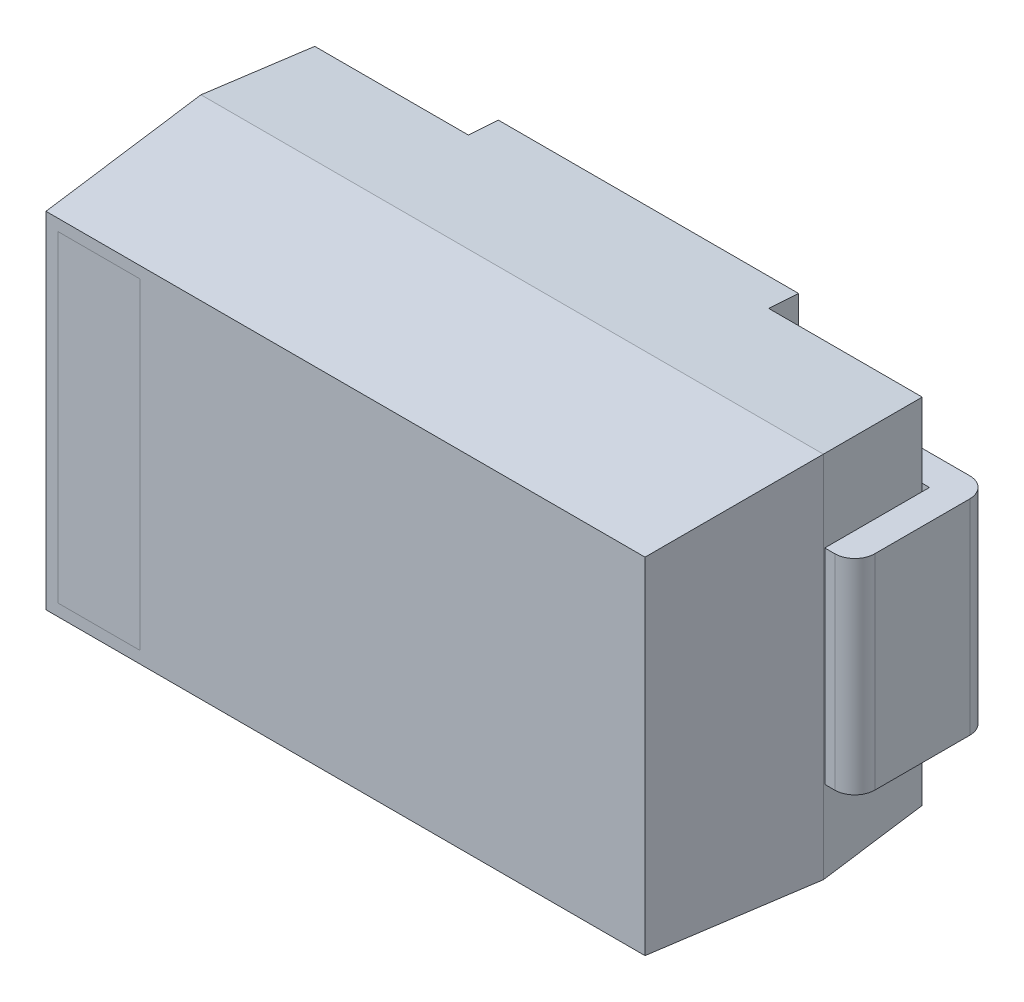
ISO-10303-21;
HEADER;
FILE_DESCRIPTION(('STEP AP214'),'2;1');
FILE_NAME('part.step','',(''),(''),'','','');
FILE_SCHEMA(('AUTOMOTIVE_DESIGN { 1 0 10303 214 1 1 1 1 }'));
ENDSEC;
DATA;
#1=APPLICATION_CONTEXT('core data for automotive mechanical design processes');
#2=APPLICATION_PROTOCOL_DEFINITION('international standard','automotive_design',2000,#1);
#3=PRODUCT_CONTEXT('',#1,'mechanical');
#4=PRODUCT('Part','Part','',(#3));
#5=PRODUCT_RELATED_PRODUCT_CATEGORY('part','',(#4));
#6=PRODUCT_DEFINITION_FORMATION('','',#4);
#7=PRODUCT_DEFINITION_CONTEXT('part definition',#1,'design');
#8=PRODUCT_DEFINITION('design','',#6,#7);
#9=PRODUCT_DEFINITION_SHAPE('','',#8);
#10=(LENGTH_UNIT() NAMED_UNIT(*) SI_UNIT(.MILLI.,.METRE.));
#11=(NAMED_UNIT(*) PLANE_ANGLE_UNIT() SI_UNIT($,.RADIAN.));
#12=(NAMED_UNIT(*) SI_UNIT($,.STERADIAN.) SOLID_ANGLE_UNIT());
#13=UNCERTAINTY_MEASURE_WITH_UNIT(LENGTH_MEASURE(1.E-05),#10,'distance_accuracy_value','');
#14=(GEOMETRIC_REPRESENTATION_CONTEXT(3) GLOBAL_UNCERTAINTY_ASSIGNED_CONTEXT((#13)) GLOBAL_UNIT_ASSIGNED_CONTEXT((#10,
#11,#12)) REPRESENTATION_CONTEXT('',''));
#15=CARTESIAN_POINT('',(0.,0.,0.));
#16=DIRECTION('',(0.,0.,1.));
#17=DIRECTION('',(1.,0.,0.));
#18=AXIS2_PLACEMENT_3D('',#15,#16,#17);
#19=CARTESIAN_POINT('',(-2.353333333333,0.75,0.842343333333));
#20=DIRECTION('',(0.,-1.,0.));
#21=DIRECTION('',(0.,0.,-1.));
#22=AXIS2_PLACEMENT_3D('',#19,#20,#21);
#23=CYLINDRICAL_SURFACE('',#22,0.146666666667);
#24=CARTESIAN_POINT('',(-2.353333333333,0.75,0.842343333333));
#25=DIRECTION('',(0.,-1.,0.));
#26=DIRECTION('',(0.,0.,1.));
#27=AXIS2_PLACEMENT_3D('',#24,#25,#26);
#28=CIRCLE('',#27,0.146666666667);
#29=CARTESIAN_POINT('',(-2.353333333333,0.75,0.98901));
#30=VERTEX_POINT('',#29);
#31=CARTESIAN_POINT('',(-2.5,0.75,0.842343333333));
#32=VERTEX_POINT('',#31);
#33=EDGE_CURVE('E414',#30,#32,#28,.T.);
#34=ORIENTED_EDGE('',*,*,#33,.T.);
#35=DIRECTION('',(0.,1.,0.));
#36=VECTOR('',#35,1.);
#37=CARTESIAN_POINT('',(-2.5,0.,0.842343333333));
#38=LINE('',#37,#36);
#39=CARTESIAN_POINT('',(-2.5,-0.75,0.842343333333));
#40=VERTEX_POINT('',#39);
#41=EDGE_CURVE('E403',#40,#32,#38,.T.);
#42=ORIENTED_EDGE('',*,*,#41,.F.);
#43=CARTESIAN_POINT('',(-2.353333333333,-0.75,0.842343333333));
#44=DIRECTION('',(0.,1.,0.));
#45=DIRECTION('',(-1.,0.,0.));
#46=AXIS2_PLACEMENT_3D('',#43,#44,#45);
#47=CIRCLE('',#46,0.146666666667);
#48=CARTESIAN_POINT('',(-2.353333333333,-0.75,0.98901));
#49=VERTEX_POINT('',#48);
#50=EDGE_CURVE('E739',#40,#49,#47,.T.);
#51=ORIENTED_EDGE('',*,*,#50,.T.);
#52=DIRECTION('',(0.,-1.,0.));
#53=VECTOR('',#52,1.);
#54=CARTESIAN_POINT('',(-2.353333333333,0.,0.98901));
#55=LINE('',#54,#53);
#56=EDGE_CURVE('E832',#30,#49,#55,.T.);
#57=ORIENTED_EDGE('',*,*,#56,.F.);
#58=EDGE_LOOP('',(#34,#42,#51,#57));
#59=FACE_BOUND('',#58,.T.);
#60=ADVANCED_FACE('F17',(#59),#23,.T.);
#61=CARTESIAN_POINT('',(-2.5,-0.751,0.843343333333));
#62=DIRECTION('',(-1.,0.,0.));
#63=DIRECTION('',(0.,1.,0.));
#64=AXIS2_PLACEMENT_3D('',#61,#62,#63);
#65=PLANE('',#64);
#66=DIRECTION('',(0.,0.,-1.));
#67=VECTOR('',#66,1.);
#68=CARTESIAN_POINT('',(-2.5,0.75,0.494505));
#69=LINE('',#68,#67);
#70=CARTESIAN_POINT('',(-2.5,0.75,0.146666666667));
#71=VERTEX_POINT('',#70);
#72=EDGE_CURVE('E406',#32,#71,#69,.T.);
#73=ORIENTED_EDGE('',*,*,#72,.T.);
#74=DIRECTION('',(0.,1.,0.));
#75=VECTOR('',#74,1.);
#76=CARTESIAN_POINT('',(-2.5,0.,0.146666666667));
#77=LINE('',#76,#75);
#78=CARTESIAN_POINT('',(-2.5,-0.75,0.146666666667));
#79=VERTEX_POINT('',#78);
#80=EDGE_CURVE('E837',#79,#71,#77,.T.);
#81=ORIENTED_EDGE('',*,*,#80,.F.);
#82=DIRECTION('',(0.,0.,1.));
#83=VECTOR('',#82,1.);
#84=CARTESIAN_POINT('',(-2.5,-0.75,0.494505));
#85=LINE('',#84,#83);
#86=EDGE_CURVE('E407',#79,#40,#85,.T.);
#87=ORIENTED_EDGE('',*,*,#86,.T.);
#88=ORIENTED_EDGE('',*,*,#41,.T.);
#89=EDGE_LOOP('',(#73,#81,#87,#88));
#90=FACE_BOUND('',#89,.T.);
#91=ADVANCED_FACE('F430',(#90),#65,.T.);
#92=CARTESIAN_POINT('',(2.28070097561994,-1.36,1.00897540140447));
#93=DIRECTION('',(0.997540140446717,0.,-0.0700975619942901));
#94=DIRECTION('',(-0.0700975619942901,0.,-0.997540140446717));
#95=AXIS2_PLACEMENT_3D('',#92,#93,#94);
#96=PLANE('',#95);
#97=CARTESIAN_POINT('',(2.225259344883,1.295259344883,0.22));
#98=DIRECTION('',(0.0699259759929593,0.0699259759929665,0.995098344769432));
#99=VECTOR('',#98,1.);
#100=LINE('',#97,#99);
#101=CARTESIAN_POINT('',(2.225259344883,1.295259344883,0.22));
#102=VERTEX_POINT('',#101);
#103=CARTESIAN_POINT('',(2.28,1.35,0.999));
#104=VERTEX_POINT('',#103);
#105=EDGE_CURVE('E254',#102,#104,#100,.T.);
#106=ORIENTED_EDGE('',*,*,#105,.T.);
#107=DIRECTION('',(0.,1.,0.));
#108=VECTOR('',#107,1.);
#109=CARTESIAN_POINT('',(2.28,0.,0.999));
#110=LINE('',#109,#108);
#111=CARTESIAN_POINT('',(2.28,-1.35,0.999));
#112=VERTEX_POINT('',#111);
#113=EDGE_CURVE('E393',#112,#104,#110,.T.);
#114=ORIENTED_EDGE('',*,*,#113,.F.);
#115=CARTESIAN_POINT('',(2.28,-1.35,0.999));
#116=DIRECTION('',(-0.0699259759929593,0.0699259759929665,-0.995098344769432));
#117=VECTOR('',#116,1.);
#118=LINE('',#115,#117);
#119=CARTESIAN_POINT('',(2.225259344883,-1.295259344883,0.22));
#120=VERTEX_POINT('',#119);
#121=EDGE_CURVE('E783',#112,#120,#118,.T.);
#122=ORIENTED_EDGE('',*,*,#121,.T.);
#123=DIRECTION('',(0.,1.,0.));
#124=VECTOR('',#123,1.);
#125=CARTESIAN_POINT('',(2.225259344883,0.,0.22));
#126=LINE('',#125,#124);
#127=CARTESIAN_POINT('',(2.2253366423423,-0.75,0.221100000000014));
#128=VERTEX_POINT('',#127);
#129=EDGE_CURVE('E850',#120,#128,#126,.T.);
#130=ORIENTED_EDGE('',*,*,#129,.T.);
#131=DIRECTION('',(0.,1.,0.));
#132=VECTOR('',#131,1.);
#133=CARTESIAN_POINT('',(2.22541393980118,0.,0.222200000000058));
#134=LINE('',#133,#132);
#135=CARTESIAN_POINT('',(2.2253366423423,0.75,0.221100000000014));
#136=VERTEX_POINT('',#135);
#137=EDGE_CURVE('E852',#128,#136,#134,.T.);
#138=ORIENTED_EDGE('',*,*,#137,.T.);
#139=DIRECTION('',(0.,1.,0.));
#140=VECTOR('',#139,1.);
#141=CARTESIAN_POINT('',(2.225259344883,0.,0.22));
#142=LINE('',#141,#140);
#143=EDGE_CURVE('E857',#136,#102,#142,.T.);
#144=ORIENTED_EDGE('',*,*,#143,.T.);
#145=EDGE_LOOP('',(#106,#114,#122,#130,#138,#144));
#146=FACE_BOUND('',#145,.T.);
#147=ADVANCED_FACE('F451',(#146),#96,.T.);
#148=CARTESIAN_POINT('',(-2.22455836926306,-1.36,0.210024598595533));
#149=DIRECTION('',(-0.997540140446717,0.,-0.0700975619942901));
#150=DIRECTION('',(-0.0700975619942901,0.,0.997540140446717));
#151=AXIS2_PLACEMENT_3D('',#148,#149,#150);
#152=PLANE('',#151);
#153=CARTESIAN_POINT('',(-2.225259344883,-1.295259344883,0.22));
#154=DIRECTION('',(-0.0699259759929593,-0.0699259759929665,0.995098344769432));
#155=VECTOR('',#154,1.);
#156=LINE('',#153,#155);
#157=CARTESIAN_POINT('',(-2.225259344883,-1.295259344883,0.22));
#158=VERTEX_POINT('',#157);
#159=CARTESIAN_POINT('',(-2.28,-1.35,0.999));
#160=VERTEX_POINT('',#159);
#161=EDGE_CURVE('E287',#158,#160,#156,.T.);
#162=ORIENTED_EDGE('',*,*,#161,.T.);
#163=DIRECTION('',(0.,-1.,0.));
#164=VECTOR('',#163,1.);
#165=CARTESIAN_POINT('',(-2.28,0.,0.999));
#166=LINE('',#165,#164);
#167=CARTESIAN_POINT('',(-2.28,1.35,0.999));
#168=VERTEX_POINT('',#167);
#169=EDGE_CURVE('E784',#168,#160,#166,.T.);
#170=ORIENTED_EDGE('',*,*,#169,.F.);
#171=CARTESIAN_POINT('',(-2.28,1.35,0.999));
#172=DIRECTION('',(0.0699259759929593,-0.0699259759929665,-0.995098344769432));
#173=VECTOR('',#172,1.);
#174=LINE('',#171,#173);
#175=CARTESIAN_POINT('',(-2.225259344883,1.295259344883,0.22));
#176=VERTEX_POINT('',#175);
#177=EDGE_CURVE('E486',#168,#176,#174,.T.);
#178=ORIENTED_EDGE('',*,*,#177,.T.);
#179=DIRECTION('',(0.,-1.,0.));
#180=VECTOR('',#179,1.);
#181=CARTESIAN_POINT('',(-2.225259344883,0.,0.22));
#182=LINE('',#181,#180);
#183=CARTESIAN_POINT('',(-2.2253366423425,0.75,0.2211));
#184=VERTEX_POINT('',#183);
#185=EDGE_CURVE('E863',#176,#184,#182,.T.);
#186=ORIENTED_EDGE('',*,*,#185,.T.);
#187=DIRECTION('',(0.,1.,0.));
#188=VECTOR('',#187,1.);
#189=CARTESIAN_POINT('',(-2.225413939802,0.,0.2222));
#190=LINE('',#189,#188);
#191=CARTESIAN_POINT('',(-2.2253366423425,-0.75,0.2211));
#192=VERTEX_POINT('',#191);
#193=EDGE_CURVE('E796',#192,#184,#190,.T.);
#194=ORIENTED_EDGE('',*,*,#193,.F.);
#195=DIRECTION('',(0.,-1.,0.));
#196=VECTOR('',#195,1.);
#197=CARTESIAN_POINT('',(-2.225259344883,0.,0.22));
#198=LINE('',#197,#196);
#199=EDGE_CURVE('E239',#192,#158,#198,.T.);
#200=ORIENTED_EDGE('',*,*,#199,.T.);
#201=EDGE_LOOP('',(#162,#170,#178,#186,#194,#200));
#202=FACE_BOUND('',#201,.T.);
#203=ADVANCED_FACE('F460',(#202),#152,.T.);
#204=CARTESIAN_POINT('',(-2.224413939802,-0.751,0.2222));
#205=DIRECTION('',(0.,0.,1.));
#206=DIRECTION('',(0.,1.,0.));
#207=AXIS2_PLACEMENT_3D('',#204,#205,#206);
#208=PLANE('',#207);
#209=DIRECTION('',(0.,1.,0.));
#210=VECTOR('',#209,1.);
#211=CARTESIAN_POINT('',(-2.28,0.,0.2222));
#212=LINE('',#211,#210);
#213=CARTESIAN_POINT('',(-2.28,-0.75,0.2222));
#214=VERTEX_POINT('',#213);
#215=CARTESIAN_POINT('',(-2.28,0.75,0.2222));
#216=VERTEX_POINT('',#215);
#217=EDGE_CURVE('E799',#214,#216,#212,.T.);
#218=ORIENTED_EDGE('',*,*,#217,.F.);
#219=DIRECTION('',(1.,0.,0.));
#220=VECTOR('',#219,1.);
#221=CARTESIAN_POINT('',(-2.252706969901,-0.75,0.2222));
#222=LINE('',#221,#220);
#223=EDGE_CURVE('E795',#214,#192,#222,.T.);
#224=ORIENTED_EDGE('',*,*,#223,.T.);
#225=ORIENTED_EDGE('',*,*,#193,.T.);
#226=DIRECTION('',(-1.,0.,0.));
#227=VECTOR('',#226,1.);
#228=CARTESIAN_POINT('',(-2.252706969901,0.75,0.2222));
#229=LINE('',#228,#227);
#230=EDGE_CURVE('E793',#184,#216,#229,.T.);
#231=ORIENTED_EDGE('',*,*,#230,.T.);
#232=EDGE_LOOP('',(#218,#224,#225,#231));
#233=FACE_BOUND('',#232,.T.);
#234=ADVANCED_FACE('F1014',(#233),#208,.T.);
#235=CARTESIAN_POINT('',(-2.279,-0.751,0.98901));
#236=DIRECTION('',(0.,0.,1.));
#237=DIRECTION('',(0.,1.,0.));
#238=AXIS2_PLACEMENT_3D('',#235,#236,#237);
#239=PLANE('',#238);
#240=DIRECTION('',(-1.,0.,0.));
#241=VECTOR('',#240,1.);
#242=CARTESIAN_POINT('',(-2.3166666666665,0.75,0.98901));
#243=LINE('',#242,#241);
#244=CARTESIAN_POINT('',(-2.28,0.75,0.98901));
#245=VERTEX_POINT('',#244);
#246=EDGE_CURVE('E818',#245,#30,#243,.T.);
#247=ORIENTED_EDGE('',*,*,#246,.T.);
#248=ORIENTED_EDGE('',*,*,#56,.T.);
#249=DIRECTION('',(1.,0.,0.));
#250=VECTOR('',#249,1.);
#251=CARTESIAN_POINT('',(-2.3166666666665,-0.75,0.98901));
#252=LINE('',#251,#250);
#253=CARTESIAN_POINT('',(-2.28,-0.75,0.98901));
#254=VERTEX_POINT('',#253);
#255=EDGE_CURVE('E806',#49,#254,#252,.T.);
#256=ORIENTED_EDGE('',*,*,#255,.T.);
#257=DIRECTION('',(0.,-1.,0.));
#258=VECTOR('',#257,1.);
#259=CARTESIAN_POINT('',(-2.28,0.,0.98901));
#260=LINE('',#259,#258);
#261=EDGE_CURVE('E802',#245,#254,#260,.T.);
#262=ORIENTED_EDGE('',*,*,#261,.F.);
#263=EDGE_LOOP('',(#247,#248,#256,#262));
#264=FACE_BOUND('',#263,.T.);
#265=ADVANCED_FACE('F516',(#264),#239,.T.);
#266=CARTESIAN_POINT('',(-2.353333333333,0.75,0.146666666667));
#267=DIRECTION('',(0.,-1.,0.));
#268=DIRECTION('',(0.,0.,-1.));
#269=AXIS2_PLACEMENT_3D('',#266,#267,#268);
#270=CYLINDRICAL_SURFACE('',#269,0.146666666667);
#271=DIRECTION('',(0.,1.,0.));
#272=VECTOR('',#271,1.);
#273=CARTESIAN_POINT('',(-2.353333333333,0.,0.));
#274=LINE('',#273,#272);
#275=CARTESIAN_POINT('',(-2.353333333333,-0.75,0.));
#276=VERTEX_POINT('',#275);
#277=CARTESIAN_POINT('',(-2.353333333333,0.75,0.));
#278=VERTEX_POINT('',#277);
#279=EDGE_CURVE('E827',#276,#278,#274,.T.);
#280=ORIENTED_EDGE('',*,*,#279,.F.);
#281=CARTESIAN_POINT('',(-2.353333333333,-0.75,0.146666666667));
#282=DIRECTION('',(0.,1.,0.));
#283=DIRECTION('',(0.,0.,-1.));
#284=AXIS2_PLACEMENT_3D('',#281,#282,#283);
#285=CIRCLE('',#284,0.146666666667);
#286=EDGE_CURVE('E397',#276,#79,#285,.T.);
#287=ORIENTED_EDGE('',*,*,#286,.T.);
#288=ORIENTED_EDGE('',*,*,#80,.T.);
#289=CARTESIAN_POINT('',(-2.353333333333,0.75,0.146666666667));
#290=DIRECTION('',(0.,-1.,0.));
#291=DIRECTION('',(-1.,0.,0.));
#292=AXIS2_PLACEMENT_3D('',#289,#290,#291);
#293=CIRCLE('',#292,0.146666666667);
#294=EDGE_CURVE('E764',#71,#278,#293,.T.);
#295=ORIENTED_EDGE('',*,*,#294,.T.);
#296=EDGE_LOOP('',(#280,#287,#288,#295));
#297=FACE_BOUND('',#296,.T.);
#298=ADVANCED_FACE('F505',(#297),#270,.T.);
#299=CARTESIAN_POINT('',(2.19349884479406,-1.36,2.22997540140447));
#300=DIRECTION('',(0.997540140446743,0.,0.0700975619939197));
#301=DIRECTION('',(0.0700975619939197,0.,-0.997540140446743));
#302=AXIS2_PLACEMENT_3D('',#299,#300,#301);
#303=PLANE('',#302);
#304=CARTESIAN_POINT('',(2.194199820414,-1.264199820414,2.22));
#305=DIRECTION('',(0.,1.,0.));
#306=VECTOR('',#305,1.);
#307=LINE('',#304,#306);
#308=CARTESIAN_POINT('',(2.194199820414,-1.264199820289,2.22));
#309=VERTEX_POINT('',#308);
#310=CARTESIAN_POINT('',(2.194199820414,1.264199820289,2.22));
#311=VERTEX_POINT('',#310);
#312=EDGE_CURVE('E699',#309,#311,#307,.T.);
#313=ORIENTED_EDGE('',*,*,#312,.F.);
#314=CARTESIAN_POINT('',(2.194199820414,-1.264199820414,2.22));
#315=DIRECTION('',(0.0699259759925921,-0.0699259759925905,-0.995098344769484));
#316=VECTOR('',#315,1.);
#317=LINE('',#314,#316);
#318=EDGE_CURVE('E532',#309,#112,#317,.T.);
#319=ORIENTED_EDGE('',*,*,#318,.T.);
#320=ORIENTED_EDGE('',*,*,#113,.T.);
#321=CARTESIAN_POINT('',(2.28,1.35,0.999));
#322=DIRECTION('',(-0.0699259759925921,-0.0699259759925904,0.995098344769484));
#323=VECTOR('',#322,1.);
#324=LINE('',#321,#323);
#325=EDGE_CURVE('E396',#104,#311,#324,.T.);
#326=ORIENTED_EDGE('',*,*,#325,.T.);
#327=EDGE_LOOP('',(#313,#319,#320,#326));
#328=FACE_BOUND('',#327,.T.);
#329=ADVANCED_FACE('F515',(#328),#303,.T.);
#330=CARTESIAN_POINT('',(-2.28070097561994,-1.36,0.989024598595533));
#331=DIRECTION('',(-0.997540140446743,0.,0.0700975619939197));
#332=DIRECTION('',(0.0700975619939197,0.,0.997540140446743));
#333=AXIS2_PLACEMENT_3D('',#330,#331,#332);
#334=PLANE('',#333);
#335=CARTESIAN_POINT('',(-2.194199820414,1.264199820414,2.22));
#336=DIRECTION('',(0.,-1.,0.));
#337=VECTOR('',#336,1.);
#338=LINE('',#335,#337);
#339=CARTESIAN_POINT('',(-2.194199820289,1.264199820414,2.22));
#340=VERTEX_POINT('',#339);
#341=CARTESIAN_POINT('',(-2.194199820414,-1.264199820289,2.22));
#342=VERTEX_POINT('',#341);
#343=EDGE_CURVE('E687',#340,#342,#338,.T.);
#344=ORIENTED_EDGE('',*,*,#343,.F.);
#345=CARTESIAN_POINT('',(-2.194199820414,1.264199820414,2.22));
#346=DIRECTION('',(-0.0699259759925918,0.0699259759925907,-0.995098344769484));
#347=VECTOR('',#346,1.);
#348=LINE('',#345,#347);
#349=EDGE_CURVE('E567',#340,#168,#348,.T.);
#350=ORIENTED_EDGE('',*,*,#349,.T.);
#351=ORIENTED_EDGE('',*,*,#169,.T.);
#352=CARTESIAN_POINT('',(-2.28,-1.35,0.999));
#353=DIRECTION('',(0.0699259759925918,0.0699259759925907,0.995098344769484));
#354=VECTOR('',#353,1.);
#355=LINE('',#352,#354);
#356=EDGE_CURVE('E720',#160,#342,#355,.T.);
#357=ORIENTED_EDGE('',*,*,#356,.T.);
#358=EDGE_LOOP('',(#344,#350,#351,#357));
#359=FACE_BOUND('',#358,.T.);
#360=ADVANCED_FACE('F572',(#359),#334,.T.);
#361=CARTESIAN_POINT('',(-2.67309504415258,1.03566993553694,2.2178));
#362=DIRECTION('',(0.,0.,1.));
#363=DIRECTION('',(0.246713052972106,-0.969088576701419,0.));
#364=AXIS2_PLACEMENT_3D('',#361,#362,#363);
#365=PLANE('',#364);
#366=CARTESIAN_POINT('',(-2.108399640828,-1.178399640828,2.22));
#367=DIRECTION('',(0.,1.,0.));
#368=VECTOR('',#367,1.);
#369=LINE('',#366,#368);
#370=CARTESIAN_POINT('',(-2.108399640703,-1.178399640828,2.2189));
#371=VERTEX_POINT('',#370);
#372=CARTESIAN_POINT('',(-2.108399640703,1.178399640828,2.2189));
#373=VERTEX_POINT('',#372);
#374=EDGE_CURVE('E544',#371,#373,#369,.T.);
#375=ORIENTED_EDGE('',*,*,#374,.F.);
#376=CARTESIAN_POINT('',(-1.508399640828,-1.178399640828,2.22));
#377=DIRECTION('',(-1.,0.,0.));
#378=VECTOR('',#377,1.);
#379=LINE('',#376,#378);
#380=CARTESIAN_POINT('',(-1.508399640828,-1.178399640828,2.2189));
#381=VERTEX_POINT('',#380);
#382=EDGE_CURVE('E608',#381,#371,#379,.T.);
#383=ORIENTED_EDGE('',*,*,#382,.F.);
#384=CARTESIAN_POINT('',(-1.508399640828,1.178399640828,2.22));
#385=DIRECTION('',(0.,-1.,0.));
#386=VECTOR('',#385,1.);
#387=LINE('',#384,#386);
#388=CARTESIAN_POINT('',(-1.508399640828,1.178399640828,2.2189));
#389=VERTEX_POINT('',#388);
#390=EDGE_CURVE('E619',#389,#381,#387,.T.);
#391=ORIENTED_EDGE('',*,*,#390,.F.);
#392=CARTESIAN_POINT('',(-2.108399640828,1.178399640828,2.22));
#393=DIRECTION('',(1.,0.,0.));
#394=VECTOR('',#393,1.);
#395=LINE('',#392,#394);
#396=EDGE_CURVE('E630',#373,#389,#395,.T.);
#397=ORIENTED_EDGE('',*,*,#396,.F.);
#398=EDGE_LOOP('',(#375,#383,#391,#397));
#399=FACE_BOUND('',#398,.T.);
#400=ADVANCED_FACE('F581',(#399),#365,.T.);
#401=CARTESIAN_POINT('',(-2.28,0.751,0.99001));
#402=DIRECTION('',(1.,0.,0.));
#403=DIRECTION('',(0.,-1.,0.));
#404=AXIS2_PLACEMENT_3D('',#401,#402,#403);
#405=PLANE('',#404);
#406=ORIENTED_EDGE('',*,*,#261,.T.);
#407=DIRECTION('',(0.,0.,1.));
#408=VECTOR('',#407,1.);
#409=CARTESIAN_POINT('',(-2.28,-0.75,0.494505));
#410=LINE('',#409,#408);
#411=EDGE_CURVE('E812',#214,#254,#410,.T.);
#412=ORIENTED_EDGE('',*,*,#411,.F.);
#413=ORIENTED_EDGE('',*,*,#217,.T.);
#414=DIRECTION('',(0.,0.,-1.));
#415=VECTOR('',#414,1.);
#416=CARTESIAN_POINT('',(-2.28,0.75,0.494505));
#417=LINE('',#416,#415);
#418=EDGE_CURVE('E223',#245,#216,#417,.T.);
#419=ORIENTED_EDGE('',*,*,#418,.F.);
#420=EDGE_LOOP('',(#406,#412,#413,#419));
#421=FACE_BOUND('',#420,.T.);
#422=ADVANCED_FACE('F1017',(#421),#405,.T.);
#423=CARTESIAN_POINT('',(-2.354333333333,0.751,0.));
#424=DIRECTION('',(0.,0.,-1.));
#425=DIRECTION('',(1.,0.,0.));
#426=AXIS2_PLACEMENT_3D('',#423,#424,#425);
#427=PLANE('',#426);
#428=DIRECTION('',(-1.,0.,0.));
#429=VECTOR('',#428,1.);
#430=CARTESIAN_POINT('',(-1.82,0.75,0.));
#431=LINE('',#430,#429);
#432=CARTESIAN_POINT('',(-1.14,0.75,0.));
#433=VERTEX_POINT('',#432);
#434=EDGE_CURVE('E559',#433,#278,#431,.T.);
#435=ORIENTED_EDGE('',*,*,#434,.F.);
#436=DIRECTION('',(0.,1.,0.));
#437=VECTOR('',#436,1.);
#438=CARTESIAN_POINT('',(-1.14,0.,0.));
#439=LINE('',#438,#437);
#440=CARTESIAN_POINT('',(-1.14,-0.75,0.));
#441=VERTEX_POINT('',#440);
#442=EDGE_CURVE('E224',#441,#433,#439,.T.);
#443=ORIENTED_EDGE('',*,*,#442,.F.);
#444=DIRECTION('',(1.,0.,0.));
#445=VECTOR('',#444,1.);
#446=CARTESIAN_POINT('',(-1.82,-0.75,0.));
#447=LINE('',#446,#445);
#448=EDGE_CURVE('E221',#276,#441,#447,.T.);
#449=ORIENTED_EDGE('',*,*,#448,.F.);
#450=ORIENTED_EDGE('',*,*,#279,.T.);
#451=EDGE_LOOP('',(#435,#443,#449,#450));
#452=FACE_BOUND('',#451,.T.);
#453=ADVANCED_FACE('F657',(#452),#427,.T.);
#454=CARTESIAN_POINT('',(-3.28925930550833,-0.634429615426626,2.22));
#455=DIRECTION('',(0.,0.,1.));
#456=DIRECTION('',(0.866473406917989,-0.499223231734995,0.));
#457=AXIS2_PLACEMENT_3D('',#454,#455,#456);
#458=PLANE('',#457);
#459=ORIENTED_EDGE('',*,*,#382,.T.);
#460=ORIENTED_EDGE('',*,*,#374,.T.);
#461=ORIENTED_EDGE('',*,*,#396,.T.);
#462=ORIENTED_EDGE('',*,*,#390,.T.);
#463=EDGE_LOOP('',(#459,#460,#461,#462));
#464=FACE_BOUND('',#463,.T.);
#465=ORIENTED_EDGE('',*,*,#343,.T.);
#466=DIRECTION('',(-1.,0.,0.));
#467=VECTOR('',#466,1.);
#468=CARTESIAN_POINT('',(0.,-1.264199820414,2.22));
#469=LINE('',#468,#467);
#470=EDGE_CURVE('E536',#309,#342,#469,.T.);
#471=ORIENTED_EDGE('',*,*,#470,.F.);
#472=ORIENTED_EDGE('',*,*,#312,.T.);
#473=DIRECTION('',(1.,0.,0.));
#474=VECTOR('',#473,1.);
#475=CARTESIAN_POINT('',(0.,1.264199820414,2.22));
#476=LINE('',#475,#474);
#477=EDGE_CURVE('E390',#340,#311,#476,.T.);
#478=ORIENTED_EDGE('',*,*,#477,.F.);
#479=EDGE_LOOP('',(#465,#471,#472,#478));
#480=FACE_BOUND('',#479,.T.);
#481=ADVANCED_FACE('F646',(#464,#480),#458,.T.);
#482=CARTESIAN_POINT('',(-2.29,-1.26349884479406,2.22997540140447));
#483=DIRECTION('',(0.,-0.997540140446743,0.0700975619939195));
#484=DIRECTION('',(0.,-0.0700975619939195,-0.997540140446743));
#485=AXIS2_PLACEMENT_3D('',#482,#483,#484);
#486=PLANE('',#485);
#487=ORIENTED_EDGE('',*,*,#470,.T.);
#488=ORIENTED_EDGE('',*,*,#356,.F.);
#489=DIRECTION('',(-1.,0.,0.));
#490=VECTOR('',#489,1.);
#491=CARTESIAN_POINT('',(0.,-1.35,0.999));
#492=LINE('',#491,#490);
#493=EDGE_CURVE('E243',#112,#160,#492,.T.);
#494=ORIENTED_EDGE('',*,*,#493,.F.);
#495=ORIENTED_EDGE('',*,*,#318,.F.);
#496=EDGE_LOOP('',(#487,#488,#494,#495));
#497=FACE_BOUND('',#496,.T.);
#498=ADVANCED_FACE('F656',(#497),#486,.T.);
#499=CARTESIAN_POINT('',(-2.501,-0.75,0.99001));
#500=DIRECTION('',(0.,-1.,0.));
#501=DIRECTION('',(0.,0.,-1.));
#502=AXIS2_PLACEMENT_3D('',#499,#500,#501);
#503=PLANE('',#502);
#504=ORIENTED_EDGE('',*,*,#255,.F.);
#505=ORIENTED_EDGE('',*,*,#50,.F.);
#506=ORIENTED_EDGE('',*,*,#86,.F.);
#507=ORIENTED_EDGE('',*,*,#286,.F.);
#508=ORIENTED_EDGE('',*,*,#448,.T.);
#509=DIRECTION('',(0.,0.,-1.));
#510=VECTOR('',#509,1.);
#511=CARTESIAN_POINT('',(-1.14,-0.75,0.11));
#512=LINE('',#511,#510);
#513=CARTESIAN_POINT('',(-1.14,-0.75,0.22));
#514=VERTEX_POINT('',#513);
#515=EDGE_CURVE('E214',#514,#441,#512,.T.);
#516=ORIENTED_EDGE('',*,*,#515,.F.);
#517=DIRECTION('',(1.,0.,0.));
#518=VECTOR('',#517,1.);
#519=CARTESIAN_POINT('',(-2.225259344883,-0.750000000000001,0.22));
#520=LINE('',#519,#518);
#521=EDGE_CURVE('E218',#192,#514,#520,.T.);
#522=ORIENTED_EDGE('',*,*,#521,.F.);
#523=ORIENTED_EDGE('',*,*,#223,.F.);
#524=ORIENTED_EDGE('',*,*,#411,.T.);
#525=EDGE_LOOP('',(#504,#505,#506,#507,#508,#516,#522,#523,#524));
#526=FACE_BOUND('',#525,.T.);
#527=ADVANCED_FACE('F216',(#526),#503,.T.);
#528=CARTESIAN_POINT('',(-1.14,0.751,0.221));
#529=DIRECTION('',(1.,0.,0.));
#530=DIRECTION('',(0.,-1.,0.));
#531=AXIS2_PLACEMENT_3D('',#528,#529,#530);
#532=PLANE('',#531);
#533=DIRECTION('',(0.,1.,0.));
#534=VECTOR('',#533,1.);
#535=CARTESIAN_POINT('',(-1.14,-0.75,0.22));
#536=LINE('',#535,#534);
#537=CARTESIAN_POINT('',(-1.14,0.75,0.22));
#538=VERTEX_POINT('',#537);
#539=EDGE_CURVE('E227',#514,#538,#536,.T.);
#540=ORIENTED_EDGE('',*,*,#539,.F.);
#541=ORIENTED_EDGE('',*,*,#515,.T.);
#542=ORIENTED_EDGE('',*,*,#442,.T.);
#543=DIRECTION('',(0.,0.,-1.));
#544=VECTOR('',#543,1.);
#545=CARTESIAN_POINT('',(-1.14,0.75,0.494505));
#546=LINE('',#545,#544);
#547=EDGE_CURVE('E230',#538,#433,#546,.T.);
#548=ORIENTED_EDGE('',*,*,#547,.F.);
#549=EDGE_LOOP('',(#540,#541,#542,#548));
#550=FACE_BOUND('',#549,.T.);
#551=ADVANCED_FACE('F228',(#550),#532,.T.);
#552=CARTESIAN_POINT('',(-1.139,0.75,-0.000999999999999995));
#553=DIRECTION('',(0.,1.,0.));
#554=DIRECTION('',(-1.,0.,0.));
#555=AXIS2_PLACEMENT_3D('',#552,#553,#554);
#556=PLANE('',#555);
#557=ORIENTED_EDGE('',*,*,#547,.T.);
#558=ORIENTED_EDGE('',*,*,#434,.T.);
#559=ORIENTED_EDGE('',*,*,#294,.F.);
#560=ORIENTED_EDGE('',*,*,#72,.F.);
#561=ORIENTED_EDGE('',*,*,#33,.F.);
#562=ORIENTED_EDGE('',*,*,#246,.F.);
#563=ORIENTED_EDGE('',*,*,#418,.T.);
#564=ORIENTED_EDGE('',*,*,#230,.F.);
#565=DIRECTION('',(-1.,0.,0.));
#566=VECTOR('',#565,1.);
#567=CARTESIAN_POINT('',(-1.14,0.749999999999999,0.22));
#568=LINE('',#567,#566);
#569=EDGE_CURVE('E234',#538,#184,#568,.T.);
#570=ORIENTED_EDGE('',*,*,#569,.F.);
#571=EDGE_LOOP('',(#557,#558,#559,#560,#561,#562,#563,#564,#570));
#572=FACE_BOUND('',#571,.T.);
#573=ADVANCED_FACE('F306',(#572),#556,.T.);
#574=CARTESIAN_POINT('',(-2.29,1.35070097561994,0.989024598595532));
#575=DIRECTION('',(0.,0.997540140446743,0.0700975619939195));
#576=DIRECTION('',(0.,-0.0700975619939195,0.997540140446743));
#577=AXIS2_PLACEMENT_3D('',#574,#575,#576);
#578=PLANE('',#577);
#579=ORIENTED_EDGE('',*,*,#477,.T.);
#580=ORIENTED_EDGE('',*,*,#325,.F.);
#581=DIRECTION('',(1.,0.,0.));
#582=VECTOR('',#581,1.);
#583=CARTESIAN_POINT('',(0.,1.35,0.999));
#584=LINE('',#583,#582);
#585=EDGE_CURVE('E343',#168,#104,#584,.T.);
#586=ORIENTED_EDGE('',*,*,#585,.F.);
#587=ORIENTED_EDGE('',*,*,#349,.F.);
#588=EDGE_LOOP('',(#579,#580,#586,#587));
#589=FACE_BOUND('',#588,.T.);
#590=ADVANCED_FACE('F302',(#589),#578,.T.);
#591=CARTESIAN_POINT('',(-1.38440399338462,-1.78585408436899,0.22));
#592=DIRECTION('',(0.,0.,-1.));
#593=DIRECTION('',(-0.864253276514246,0.503056929218145,0.));
#594=AXIS2_PLACEMENT_3D('',#591,#592,#593);
#595=PLANE('',#594);
#596=ORIENTED_EDGE('',*,*,#569,.T.);
#597=ORIENTED_EDGE('',*,*,#185,.F.);
#598=DIRECTION('',(-1.,0.,0.));
#599=VECTOR('',#598,1.);
#600=CARTESIAN_POINT('',(0.,1.295259344883,0.22));
#601=LINE('',#600,#599);
#602=CARTESIAN_POINT('',(-1.10000000025,1.295259344883,0.22));
#603=VERTEX_POINT('',#602);
#604=EDGE_CURVE('E376',#603,#176,#601,.T.);
#605=ORIENTED_EDGE('',*,*,#604,.F.);
#606=DIRECTION('',(0.,1.,0.));
#607=VECTOR('',#606,1.);
#608=CARTESIAN_POINT('',(-1.1,0.,0.22));
#609=LINE('',#608,#607);
#610=CARTESIAN_POINT('',(-1.1,-1.295259344883,0.22));
#611=VERTEX_POINT('',#610);
#612=EDGE_CURVE('E320',#611,#603,#609,.T.);
#613=ORIENTED_EDGE('',*,*,#612,.F.);
#614=DIRECTION('',(-1.,0.,0.));
#615=VECTOR('',#614,1.);
#616=CARTESIAN_POINT('',(-1.1,-1.295259344883,0.22));
#617=LINE('',#616,#615);
#618=EDGE_CURVE('E241',#611,#158,#617,.T.);
#619=ORIENTED_EDGE('',*,*,#618,.T.);
#620=ORIENTED_EDGE('',*,*,#199,.F.);
#621=ORIENTED_EDGE('',*,*,#521,.T.);
#622=ORIENTED_EDGE('',*,*,#539,.T.);
#623=EDGE_LOOP('',(#596,#597,#605,#613,#619,#620,#621,#622));
#624=FACE_BOUND('',#623,.T.);
#625=ADVANCED_FACE('F236',(#624),#595,.T.);
#626=CARTESIAN_POINT('',(-1.101,-1.27972975550375,-0.000997540140429029));
#627=DIRECTION('',(0.,-0.997540140446757,-0.0700975619937212));
#628=DIRECTION('',(1.,0.,0.));
#629=AXIS2_PLACEMENT_3D('',#626,#627,#628);
#630=PLANE('',#629);
#631=DIRECTION('',(0.,-0.0700975619937212,0.997540140446757));
#632=VECTOR('',#631,1.);
#633=CARTESIAN_POINT('',(1.1,-1.28752959897437,0.110000000000009));
#634=LINE('',#633,#632);
#635=CARTESIAN_POINT('',(1.1,-1.27979985306587,0.));
#636=VERTEX_POINT('',#635);
#637=CARTESIAN_POINT('',(1.1000000000625,-1.295259344883,0.22));
#638=VERTEX_POINT('',#637);
#639=EDGE_CURVE('E340',#636,#638,#634,.T.);
#640=ORIENTED_EDGE('',*,*,#639,.T.);
#641=DIRECTION('',(1.,0.,0.));
#642=VECTOR('',#641,1.);
#643=CARTESIAN_POINT('',(0.,-1.295259344883,0.22));
#644=LINE('',#643,#642);
#645=EDGE_CURVE('E387',#638,#120,#644,.T.);
#646=ORIENTED_EDGE('',*,*,#645,.T.);
#647=ORIENTED_EDGE('',*,*,#121,.F.);
#648=ORIENTED_EDGE('',*,*,#493,.T.);
#649=ORIENTED_EDGE('',*,*,#161,.F.);
#650=ORIENTED_EDGE('',*,*,#618,.F.);
#651=DIRECTION('',(0.,-0.0700975619925793,0.997540140446838));
#652=VECTOR('',#651,1.);
#653=CARTESIAN_POINT('',(-1.1,-1.279799853066,0.));
#654=LINE('',#653,#652);
#655=CARTESIAN_POINT('',(-1.1,-1.279799853066,0.));
#656=VERTEX_POINT('',#655);
#657=EDGE_CURVE('E329',#656,#611,#654,.T.);
#658=ORIENTED_EDGE('',*,*,#657,.F.);
#659=DIRECTION('',(-1.,0.,0.));
#660=VECTOR('',#659,1.);
#661=CARTESIAN_POINT('',(1.1,-1.279799853066,0.));
#662=LINE('',#661,#660);
#663=EDGE_CURVE('E334',#636,#656,#662,.T.);
#664=ORIENTED_EDGE('',*,*,#663,.F.);
#665=EDGE_LOOP('',(#640,#646,#647,#648,#649,#650,#658,#664));
#666=FACE_BOUND('',#665,.T.);
#667=ADVANCED_FACE('F290',(#666),#630,.T.);
#668=CARTESIAN_POINT('',(-1.1,-1.305259344883,-0.01));
#669=DIRECTION('',(-1.,0.,0.));
#670=DIRECTION('',(0.,0.,1.));
#671=AXIS2_PLACEMENT_3D('',#668,#669,#670);
#672=PLANE('',#671);
#673=ORIENTED_EDGE('',*,*,#612,.T.);
#674=DIRECTION('',(0.,0.0700975619937212,0.997540140446757));
#675=VECTOR('',#674,1.);
#676=CARTESIAN_POINT('',(-1.1,1.28752959897437,0.110000000000009));
#677=LINE('',#676,#675);
#678=CARTESIAN_POINT('',(-1.1,1.27979985306587,0.));
#679=VERTEX_POINT('',#678);
#680=EDGE_CURVE('E328',#679,#603,#677,.T.);
#681=ORIENTED_EDGE('',*,*,#680,.F.);
#682=DIRECTION('',(0.,1.,0.));
#683=VECTOR('',#682,1.);
#684=CARTESIAN_POINT('',(-1.1,-1.279799853066,0.));
#685=LINE('',#684,#683);
#686=EDGE_CURVE('E366',#656,#679,#685,.T.);
#687=ORIENTED_EDGE('',*,*,#686,.F.);
#688=ORIENTED_EDGE('',*,*,#657,.T.);
#689=EDGE_LOOP('',(#673,#681,#687,#688));
#690=FACE_BOUND('',#689,.T.);
#691=ADVANCED_FACE('F272',(#690),#672,.T.);
#692=CARTESIAN_POINT('',(1.101,1.27972975550375,-0.000997540140429029));
#693=DIRECTION('',(0.,0.997540140446757,-0.0700975619937212));
#694=DIRECTION('',(-1.,0.,0.));
#695=AXIS2_PLACEMENT_3D('',#692,#693,#694);
#696=PLANE('',#695);
#697=ORIENTED_EDGE('',*,*,#680,.T.);
#698=ORIENTED_EDGE('',*,*,#604,.T.);
#699=ORIENTED_EDGE('',*,*,#177,.F.);
#700=ORIENTED_EDGE('',*,*,#585,.T.);
#701=ORIENTED_EDGE('',*,*,#105,.F.);
#702=DIRECTION('',(-1.,0.,0.));
#703=VECTOR('',#702,1.);
#704=CARTESIAN_POINT('',(0.,1.295259344883,0.22));
#705=LINE('',#704,#703);
#706=CARTESIAN_POINT('',(1.1,1.295259344883,0.22));
#707=VERTEX_POINT('',#706);
#708=EDGE_CURVE('E373',#102,#707,#705,.T.);
#709=ORIENTED_EDGE('',*,*,#708,.T.);
#710=DIRECTION('',(0.,-0.0700975619937212,-0.997540140446757));
#711=VECTOR('',#710,1.);
#712=CARTESIAN_POINT('',(1.1,1.28752959897437,0.110000000000009));
#713=LINE('',#712,#711);
#714=CARTESIAN_POINT('',(1.1,1.27979985306587,0.));
#715=VERTEX_POINT('',#714);
#716=EDGE_CURVE('E332',#707,#715,#713,.T.);
#717=ORIENTED_EDGE('',*,*,#716,.T.);
#718=DIRECTION('',(1.,0.,0.));
#719=VECTOR('',#718,1.);
#720=CARTESIAN_POINT('',(-1.1,1.279799853066,0.));
#721=LINE('',#720,#719);
#722=EDGE_CURVE('E363',#679,#715,#721,.T.);
#723=ORIENTED_EDGE('',*,*,#722,.F.);
#724=EDGE_LOOP('',(#697,#698,#699,#700,#701,#709,#717,#723));
#725=FACE_BOUND('',#724,.T.);
#726=ADVANCED_FACE('F261',(#725),#696,.T.);
#727=CARTESIAN_POINT('',(-0.165378663226906,-2.36872332401124,0.));
#728=DIRECTION('',(0.,0.,-1.));
#729=DIRECTION('',(-0.651825367196243,0.758369099238282,0.));
#730=AXIS2_PLACEMENT_3D('',#727,#728,#729);
#731=PLANE('',#730);
#732=ORIENTED_EDGE('',*,*,#686,.T.);
#733=ORIENTED_EDGE('',*,*,#722,.T.);
#734=DIRECTION('',(0.,1.,0.));
#735=VECTOR('',#734,1.);
#736=CARTESIAN_POINT('',(1.1,0.,0.));
#737=LINE('',#736,#735);
#738=EDGE_CURVE('E335',#636,#715,#737,.T.);
#739=ORIENTED_EDGE('',*,*,#738,.F.);
#740=ORIENTED_EDGE('',*,*,#663,.T.);
#741=EDGE_LOOP('',(#732,#733,#739,#740));
#742=FACE_BOUND('',#741,.T.);
#743=ADVANCED_FACE('F271',(#742),#731,.T.);
#744=CARTESIAN_POINT('',(2.353333333333,-0.75,0.842343333333));
#745=DIRECTION('',(0.,1.,0.));
#746=DIRECTION('',(0.,0.,1.));
#747=AXIS2_PLACEMENT_3D('',#744,#745,#746);
#748=CYLINDRICAL_SURFACE('',#747,0.146666666667);
#749=CARTESIAN_POINT('',(2.353333333333,-0.75,0.842343333333));
#750=DIRECTION('',(0.,1.,0.));
#751=DIRECTION('',(0.,0.,1.));
#752=AXIS2_PLACEMENT_3D('',#749,#750,#751);
#753=CIRCLE('',#752,0.146666666667);
#754=CARTESIAN_POINT('',(2.353333333333,-0.75,0.98901));
#755=VERTEX_POINT('',#754);
#756=CARTESIAN_POINT('',(2.5,-0.75,0.842343333333));
#757=VERTEX_POINT('',#756);
#758=EDGE_CURVE('E357',#755,#757,#753,.T.);
#759=ORIENTED_EDGE('',*,*,#758,.T.);
#760=DIRECTION('',(0.,-1.,0.));
#761=VECTOR('',#760,1.);
#762=CARTESIAN_POINT('',(2.5,0.,0.842343333333));
#763=LINE('',#762,#761);
#764=CARTESIAN_POINT('',(2.5,0.75,0.842343333333));
#765=VERTEX_POINT('',#764);
#766=EDGE_CURVE('E338',#765,#757,#763,.T.);
#767=ORIENTED_EDGE('',*,*,#766,.F.);
#768=CARTESIAN_POINT('',(2.353333333333,0.75,0.842343333333));
#769=DIRECTION('',(0.,1.,0.));
#770=DIRECTION('',(0.,0.,1.));
#771=AXIS2_PLACEMENT_3D('',#768,#769,#770);
#772=CIRCLE('',#771,0.146666666667);
#773=CARTESIAN_POINT('',(2.353333333333,0.75,0.98901));
#774=VERTEX_POINT('',#773);
#775=EDGE_CURVE('E360',#765,#774,#772,.F.);
#776=ORIENTED_EDGE('',*,*,#775,.T.);
#777=DIRECTION('',(0.,1.,0.));
#778=VECTOR('',#777,1.);
#779=CARTESIAN_POINT('',(2.353333333333,0.,0.98901));
#780=LINE('',#779,#778);
#781=EDGE_CURVE('E339',#755,#774,#780,.T.);
#782=ORIENTED_EDGE('',*,*,#781,.F.);
#783=EDGE_LOOP('',(#759,#767,#776,#782));
#784=FACE_BOUND('',#783,.T.);
#785=ADVANCED_FACE('F989',(#784),#748,.T.);
#786=CARTESIAN_POINT('',(2.224413939802,0.751,0.2222));
#787=DIRECTION('',(0.,0.,1.));
#788=DIRECTION('',(0.,-1.,0.));
#789=AXIS2_PLACEMENT_3D('',#786,#787,#788);
#790=PLANE('',#789);
#791=DIRECTION('',(0.,-1.,0.));
#792=VECTOR('',#791,1.);
#793=CARTESIAN_POINT('',(2.28,0.,0.2222));
#794=LINE('',#793,#792);
#795=CARTESIAN_POINT('',(2.28,0.75,0.2222));
#796=VERTEX_POINT('',#795);
#797=CARTESIAN_POINT('',(2.28,-0.75,0.2222));
#798=VERTEX_POINT('',#797);
#799=EDGE_CURVE('E892',#796,#798,#794,.T.);
#800=ORIENTED_EDGE('',*,*,#799,.F.);
#801=DIRECTION('',(-1.,0.,0.));
#802=VECTOR('',#801,1.);
#803=CARTESIAN_POINT('',(2.252706969901,0.75,0.2222));
#804=LINE('',#803,#802);
#805=EDGE_CURVE('E889',#796,#136,#804,.T.);
#806=ORIENTED_EDGE('',*,*,#805,.T.);
#807=ORIENTED_EDGE('',*,*,#137,.F.);
#808=DIRECTION('',(1.,0.,0.));
#809=VECTOR('',#808,1.);
#810=CARTESIAN_POINT('',(2.252706969901,-0.75,0.2222));
#811=LINE('',#810,#809);
#812=EDGE_CURVE('E359',#128,#798,#811,.T.);
#813=ORIENTED_EDGE('',*,*,#812,.T.);
#814=EDGE_LOOP('',(#800,#806,#807,#813));
#815=FACE_BOUND('',#814,.T.);
#816=ADVANCED_FACE('F999',(#815),#790,.T.);
#817=CARTESIAN_POINT('',(2.279,0.751,0.98901));
#818=DIRECTION('',(0.,0.,1.));
#819=DIRECTION('',(0.,-1.,0.));
#820=AXIS2_PLACEMENT_3D('',#817,#818,#819);
#821=PLANE('',#820);
#822=DIRECTION('',(1.,0.,0.));
#823=VECTOR('',#822,1.);
#824=CARTESIAN_POINT('',(2.3166666666665,-0.75,0.98901));
#825=LINE('',#824,#823);
#826=CARTESIAN_POINT('',(2.28,-0.75,0.98901));
#827=VERTEX_POINT('',#826);
#828=EDGE_CURVE('E910',#827,#755,#825,.T.);
#829=ORIENTED_EDGE('',*,*,#828,.T.);
#830=ORIENTED_EDGE('',*,*,#781,.T.);
#831=DIRECTION('',(-1.,0.,0.));
#832=VECTOR('',#831,1.);
#833=CARTESIAN_POINT('',(2.3166666666665,0.75,0.98901));
#834=LINE('',#833,#832);
#835=CARTESIAN_POINT('',(2.28,0.75,0.98901));
#836=VERTEX_POINT('',#835);
#837=EDGE_CURVE('E900',#774,#836,#834,.T.);
#838=ORIENTED_EDGE('',*,*,#837,.T.);
#839=DIRECTION('',(0.,1.,0.));
#840=VECTOR('',#839,1.);
#841=CARTESIAN_POINT('',(2.28,0.,0.98901));
#842=LINE('',#841,#840);
#843=EDGE_CURVE('E356',#827,#836,#842,.T.);
#844=ORIENTED_EDGE('',*,*,#843,.F.);
#845=EDGE_LOOP('',(#829,#830,#838,#844));
#846=FACE_BOUND('',#845,.T.);
#847=ADVANCED_FACE('F993',(#846),#821,.T.);
#848=CARTESIAN_POINT('',(1.1,-1.305259344883,0.23));
#849=DIRECTION('',(1.,0.,0.));
#850=DIRECTION('',(0.,0.,-1.));
#851=AXIS2_PLACEMENT_3D('',#848,#849,#850);
#852=PLANE('',#851);
#853=DIRECTION('',(0.,1.,0.));
#854=VECTOR('',#853,1.);
#855=CARTESIAN_POINT('',(1.1,-1.295259344883,0.22));
#856=LINE('',#855,#854);
#857=EDGE_CURVE('E352',#638,#707,#856,.T.);
#858=ORIENTED_EDGE('',*,*,#857,.F.);
#859=ORIENTED_EDGE('',*,*,#639,.F.);
#860=ORIENTED_EDGE('',*,*,#738,.T.);
#861=ORIENTED_EDGE('',*,*,#716,.F.);
#862=EDGE_LOOP('',(#858,#859,#860,#861));
#863=FACE_BOUND('',#862,.T.);
#864=ADVANCED_FACE('F1004',(#863),#852,.T.);
#865=CARTESIAN_POINT('',(2.5,0.751,0.843343333333));
#866=DIRECTION('',(1.,0.,0.));
#867=DIRECTION('',(0.,-1.,0.));
#868=AXIS2_PLACEMENT_3D('',#865,#866,#867);
#869=PLANE('',#868);
#870=DIRECTION('',(0.,0.,-1.));
#871=VECTOR('',#870,1.);
#872=CARTESIAN_POINT('',(2.5,-0.75,0.494505));
#873=LINE('',#872,#871);
#874=CARTESIAN_POINT('',(2.5,-0.75,0.146666666667));
#875=VERTEX_POINT('',#874);
#876=EDGE_CURVE('E895',#757,#875,#873,.T.);
#877=ORIENTED_EDGE('',*,*,#876,.T.);
#878=DIRECTION('',(0.,-1.,0.));
#879=VECTOR('',#878,1.);
#880=CARTESIAN_POINT('',(2.5,0.,0.146666666667));
#881=LINE('',#880,#879);
#882=CARTESIAN_POINT('',(2.5,0.75,0.146666666667));
#883=VERTEX_POINT('',#882);
#884=EDGE_CURVE('E351',#883,#875,#881,.T.);
#885=ORIENTED_EDGE('',*,*,#884,.F.);
#886=DIRECTION('',(0.,0.,-1.));
#887=VECTOR('',#886,1.);
#888=CARTESIAN_POINT('',(2.5,0.75,0.494505));
#889=LINE('',#888,#887);
#890=EDGE_CURVE('E355',#765,#883,#889,.T.);
#891=ORIENTED_EDGE('',*,*,#890,.F.);
#892=ORIENTED_EDGE('',*,*,#766,.T.);
#893=EDGE_LOOP('',(#877,#885,#891,#892));
#894=FACE_BOUND('',#893,.T.);
#895=ADVANCED_FACE('F982',(#894),#869,.T.);
#896=CARTESIAN_POINT('',(2.28,-0.751,0.99001));
#897=DIRECTION('',(-1.,0.,0.));
#898=DIRECTION('',(0.,1.,0.));
#899=AXIS2_PLACEMENT_3D('',#896,#897,#898);
#900=PLANE('',#899);
#901=ORIENTED_EDGE('',*,*,#843,.T.);
#902=DIRECTION('',(0.,0.,1.));
#903=VECTOR('',#902,1.);
#904=CARTESIAN_POINT('',(2.28,0.75,0.494505));
#905=LINE('',#904,#903);
#906=EDGE_CURVE('E903',#796,#836,#905,.T.);
#907=ORIENTED_EDGE('',*,*,#906,.F.);
#908=ORIENTED_EDGE('',*,*,#799,.T.);
#909=DIRECTION('',(0.,0.,-1.));
#910=VECTOR('',#909,1.);
#911=CARTESIAN_POINT('',(2.28,-0.75,0.494505));
#912=LINE('',#911,#910);
#913=EDGE_CURVE('E347',#827,#798,#912,.T.);
#914=ORIENTED_EDGE('',*,*,#913,.F.);
#915=EDGE_LOOP('',(#901,#907,#908,#914));
#916=FACE_BOUND('',#915,.T.);
#917=ADVANCED_FACE('F996',(#916),#900,.T.);
#918=CARTESIAN_POINT('',(1.94085535149838,-1.78585408436899,0.22));
#919=DIRECTION('',(0.,0.,-1.));
#920=DIRECTION('',(-0.864253276514247,0.503056929218144,0.));
#921=AXIS2_PLACEMENT_3D('',#918,#919,#920);
#922=PLANE('',#921);
#923=DIRECTION('',(0.,1.,0.));
#924=VECTOR('',#923,1.);
#925=CARTESIAN_POINT('',(1.14,0.,0.22));
#926=LINE('',#925,#924);
#927=CARTESIAN_POINT('',(1.14,-0.75,0.22));
#928=VERTEX_POINT('',#927);
#929=CARTESIAN_POINT('',(1.14,0.75,0.22));
#930=VERTEX_POINT('',#929);
#931=EDGE_CURVE('E933',#928,#930,#926,.T.);
#932=ORIENTED_EDGE('',*,*,#931,.F.);
#933=DIRECTION('',(-1.,0.,0.));
#934=VECTOR('',#933,1.);
#935=CARTESIAN_POINT('',(1.82,-0.75,0.22));
#936=LINE('',#935,#934);
#937=EDGE_CURVE('E915',#128,#928,#936,.T.);
#938=ORIENTED_EDGE('',*,*,#937,.F.);
#939=ORIENTED_EDGE('',*,*,#129,.F.);
#940=ORIENTED_EDGE('',*,*,#645,.F.);
#941=ORIENTED_EDGE('',*,*,#857,.T.);
#942=ORIENTED_EDGE('',*,*,#708,.F.);
#943=ORIENTED_EDGE('',*,*,#143,.F.);
#944=DIRECTION('',(1.,0.,0.));
#945=VECTOR('',#944,1.);
#946=CARTESIAN_POINT('',(1.82,0.75,0.22));
#947=LINE('',#946,#945);
#948=EDGE_CURVE('E906',#930,#136,#947,.T.);
#949=ORIENTED_EDGE('',*,*,#948,.F.);
#950=EDGE_LOOP('',(#932,#938,#939,#940,#941,#942,#943,#949));
#951=FACE_BOUND('',#950,.T.);
#952=ADVANCED_FACE('F971',(#951),#922,.T.);
#953=CARTESIAN_POINT('',(2.501,0.75,-0.00100000000000006));
#954=DIRECTION('',(0.,1.,0.));
#955=DIRECTION('',(-1.,0.,0.));
#956=AXIS2_PLACEMENT_3D('',#953,#954,#955);
#957=PLANE('',#956);
#958=ORIENTED_EDGE('',*,*,#837,.F.);
#959=ORIENTED_EDGE('',*,*,#775,.F.);
#960=ORIENTED_EDGE('',*,*,#890,.T.);
#961=CARTESIAN_POINT('',(2.353333333333,0.75,0.146666666667));
#962=DIRECTION('',(0.,1.,0.));
#963=DIRECTION('',(0.,0.,1.));
#964=AXIS2_PLACEMENT_3D('',#961,#962,#963);
#965=CIRCLE('',#964,0.146666666667);
#966=CARTESIAN_POINT('',(2.353333333333,0.75,0.));
#967=VERTEX_POINT('',#966);
#968=EDGE_CURVE('E348',#967,#883,#965,.F.);
#969=ORIENTED_EDGE('',*,*,#968,.F.);
#970=DIRECTION('',(1.,0.,0.));
#971=VECTOR('',#970,1.);
#972=CARTESIAN_POINT('',(1.7466666666665,0.750000000000001,0.));
#973=LINE('',#972,#971);
#974=CARTESIAN_POINT('',(1.14,0.750000000000001,0.));
#975=VERTEX_POINT('',#974);
#976=EDGE_CURVE('E941',#975,#967,#973,.T.);
#977=ORIENTED_EDGE('',*,*,#976,.F.);
#978=DIRECTION('',(0.,0.,-1.));
#979=VECTOR('',#978,1.);
#980=CARTESIAN_POINT('',(1.14,0.75,0.11));
#981=LINE('',#980,#979);
#982=EDGE_CURVE('E936',#930,#975,#981,.T.);
#983=ORIENTED_EDGE('',*,*,#982,.F.);
#984=ORIENTED_EDGE('',*,*,#948,.T.);
#985=ORIENTED_EDGE('',*,*,#805,.F.);
#986=ORIENTED_EDGE('',*,*,#906,.T.);
#987=EDGE_LOOP('',(#958,#959,#960,#969,#977,#983,#984,#985,#986));
#988=FACE_BOUND('',#987,.T.);
#989=ADVANCED_FACE('F984',(#988),#957,.T.);
#990=CARTESIAN_POINT('',(2.353333333333,-0.75,0.146666666667));
#991=DIRECTION('',(0.,1.,0.));
#992=DIRECTION('',(0.,0.,1.));
#993=AXIS2_PLACEMENT_3D('',#990,#991,#992);
#994=CYLINDRICAL_SURFACE('',#993,0.146666666667);
#995=DIRECTION('',(0.,-1.,0.));
#996=VECTOR('',#995,1.);
#997=CARTESIAN_POINT('',(2.353333333333,0.,0.));
#998=LINE('',#997,#996);
#999=CARTESIAN_POINT('',(2.353333333333,-0.75,0.));
#1000=VERTEX_POINT('',#999);
#1001=EDGE_CURVE('E952',#967,#1000,#998,.T.);
#1002=ORIENTED_EDGE('',*,*,#1001,.F.);
#1003=ORIENTED_EDGE('',*,*,#968,.T.);
#1004=ORIENTED_EDGE('',*,*,#884,.T.);
#1005=CARTESIAN_POINT('',(2.353333333333,-0.75,0.146666666667));
#1006=DIRECTION('',(0.,1.,0.));
#1007=DIRECTION('',(0.,0.,1.));
#1008=AXIS2_PLACEMENT_3D('',#1005,#1006,#1007);
#1009=CIRCLE('',#1008,0.146666666667);
#1010=EDGE_CURVE('E344',#1000,#875,#1009,.F.);
#1011=ORIENTED_EDGE('',*,*,#1010,.F.);
#1012=EDGE_LOOP('',(#1002,#1003,#1004,#1011));
#1013=FACE_BOUND('',#1012,.T.);
#1014=ADVANCED_FACE('F979',(#1013),#994,.T.);
#1015=CARTESIAN_POINT('',(1.139,-0.75,0.99001));
#1016=DIRECTION('',(0.,-1.,0.));
#1017=DIRECTION('',(0.,0.,-1.));
#1018=AXIS2_PLACEMENT_3D('',#1015,#1016,#1017);
#1019=PLANE('',#1018);
#1020=DIRECTION('',(0.,0.,1.));
#1021=VECTOR('',#1020,1.);
#1022=CARTESIAN_POINT('',(1.14,-0.75,0.11));
#1023=LINE('',#1022,#1021);
#1024=CARTESIAN_POINT('',(1.14,-0.75,0.));
#1025=VERTEX_POINT('',#1024);
#1026=EDGE_CURVE('E38',#1025,#928,#1023,.T.);
#1027=ORIENTED_EDGE('',*,*,#1026,.F.);
#1028=DIRECTION('',(-1.,0.,0.));
#1029=VECTOR('',#1028,1.);
#1030=CARTESIAN_POINT('',(1.7466666666665,-0.75,0.));
#1031=LINE('',#1030,#1029);
#1032=EDGE_CURVE('E29',#1000,#1025,#1031,.T.);
#1033=ORIENTED_EDGE('',*,*,#1032,.F.);
#1034=ORIENTED_EDGE('',*,*,#1010,.T.);
#1035=ORIENTED_EDGE('',*,*,#876,.F.);
#1036=ORIENTED_EDGE('',*,*,#758,.F.);
#1037=ORIENTED_EDGE('',*,*,#828,.F.);
#1038=ORIENTED_EDGE('',*,*,#913,.T.);
#1039=ORIENTED_EDGE('',*,*,#812,.F.);
#1040=ORIENTED_EDGE('',*,*,#937,.T.);
#1041=EDGE_LOOP('',(#1027,#1033,#1034,#1035,#1036,#1037,#1038,#1039,#1040));
#1042=FACE_BOUND('',#1041,.T.);
#1043=ADVANCED_FACE('F969',(#1042),#1019,.T.);
#1044=CARTESIAN_POINT('',(1.14,-0.751,0.221));
#1045=DIRECTION('',(-1.,0.,0.));
#1046=DIRECTION('',(0.,1.,0.));
#1047=AXIS2_PLACEMENT_3D('',#1044,#1045,#1046);
#1048=PLANE('',#1047);
#1049=ORIENTED_EDGE('',*,*,#931,.T.);
#1050=ORIENTED_EDGE('',*,*,#982,.T.);
#1051=DIRECTION('',(0.,1.,0.));
#1052=VECTOR('',#1051,1.);
#1053=CARTESIAN_POINT('',(1.14,0.,0.));
#1054=LINE('',#1053,#1052);
#1055=EDGE_CURVE('E11',#1025,#975,#1054,.T.);
#1056=ORIENTED_EDGE('',*,*,#1055,.F.);
#1057=ORIENTED_EDGE('',*,*,#1026,.T.);
#1058=EDGE_LOOP('',(#1049,#1050,#1056,#1057));
#1059=FACE_BOUND('',#1058,.T.);
#1060=ADVANCED_FACE('F974',(#1059),#1048,.T.);
#1061=CARTESIAN_POINT('',(1.139,0.751000000000001,0.));
#1062=DIRECTION('',(0.,0.,-1.));
#1063=DIRECTION('',(1.,0.,0.));
#1064=AXIS2_PLACEMENT_3D('',#1061,#1062,#1063);
#1065=PLANE('',#1064);
#1066=ORIENTED_EDGE('',*,*,#1032,.T.);
#1067=ORIENTED_EDGE('',*,*,#1055,.T.);
#1068=ORIENTED_EDGE('',*,*,#976,.T.);
#1069=ORIENTED_EDGE('',*,*,#1001,.T.);
#1070=EDGE_LOOP('',(#1066,#1067,#1068,#1069));
#1071=FACE_BOUND('',#1070,.T.);
#1072=ADVANCED_FACE('F19',(#1071),#1065,.T.);
#1073=CLOSED_SHELL('',(#60,#91,#147,#203,#234,#265,#298,#329,#360,#400,#422,#453,#481,#498,#527,
#551,#573,#590,#625,#667,#691,#726,#743,#785,#816,#847,#864,#895,#917,#952,#989,#1014,#1043,
#1060,#1072));
#1074=MANIFOLD_SOLID_BREP('B1',#1073);
#1075=ADVANCED_BREP_SHAPE_REPRESENTATION('',(#18,#1074),#14);
#1076=SHAPE_DEFINITION_REPRESENTATION(#9,#1075);
ENDSEC;
END-ISO-10303-21;
